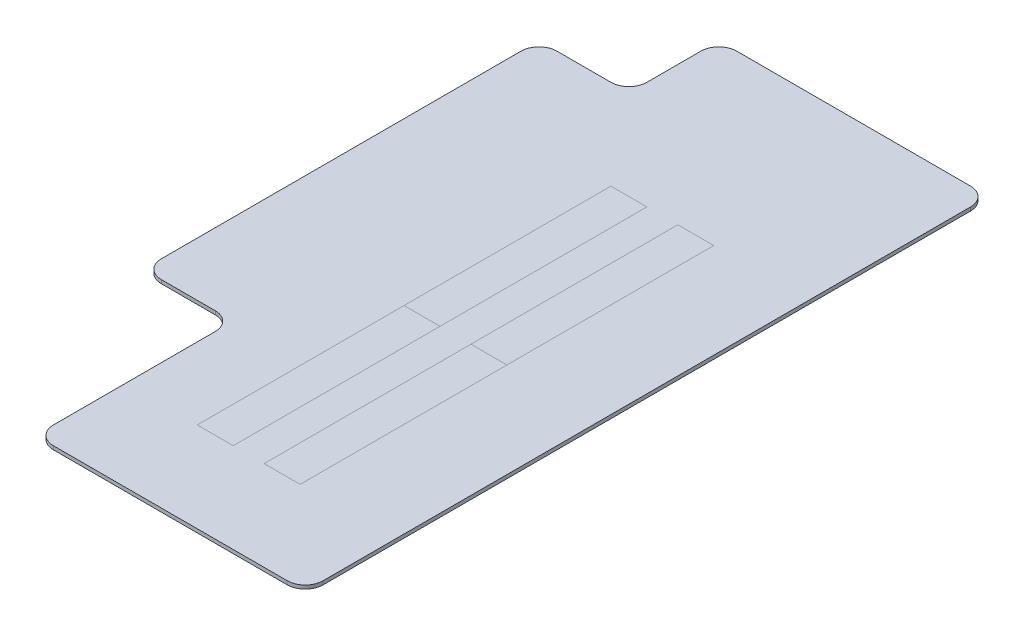
ISO-10303-21;
HEADER;
FILE_DESCRIPTION(('STEP AP214'),'2;1');
FILE_NAME('part.step','',(''),(''),'','','');
FILE_SCHEMA(('AUTOMOTIVE_DESIGN { 1 0 10303 214 1 1 1 1 }'));
ENDSEC;
DATA;
#1=APPLICATION_CONTEXT('core data for automotive mechanical design processes');
#2=APPLICATION_PROTOCOL_DEFINITION('international standard','automotive_design',2000,#1);
#3=PRODUCT_CONTEXT('',#1,'mechanical');
#4=PRODUCT('Part','Part','',(#3));
#5=PRODUCT_RELATED_PRODUCT_CATEGORY('part','',(#4));
#6=PRODUCT_DEFINITION_FORMATION('','',#4);
#7=PRODUCT_DEFINITION_CONTEXT('part definition',#1,'design');
#8=PRODUCT_DEFINITION('design','',#6,#7);
#9=PRODUCT_DEFINITION_SHAPE('','',#8);
#10=(LENGTH_UNIT() NAMED_UNIT(*) SI_UNIT(.MILLI.,.METRE.));
#11=(NAMED_UNIT(*) PLANE_ANGLE_UNIT() SI_UNIT($,.RADIAN.));
#12=(NAMED_UNIT(*) SI_UNIT($,.STERADIAN.) SOLID_ANGLE_UNIT());
#13=UNCERTAINTY_MEASURE_WITH_UNIT(LENGTH_MEASURE(1.E-05),#10,'distance_accuracy_value','');
#14=(GEOMETRIC_REPRESENTATION_CONTEXT(3) GLOBAL_UNCERTAINTY_ASSIGNED_CONTEXT((#13)) GLOBAL_UNIT_ASSIGNED_CONTEXT((#10,
#11,#12)) REPRESENTATION_CONTEXT('',''));
#15=CARTESIAN_POINT('',(0.,0.,0.));
#16=DIRECTION('',(0.,0.,1.));
#17=DIRECTION('',(1.,0.,0.));
#18=AXIS2_PLACEMENT_3D('',#15,#16,#17);
#19=CARTESIAN_POINT('',(-50.,0.,-50.));
#20=DIRECTION('',(0.,1.,0.));
#21=DIRECTION('',(0.,0.,1.));
#22=AXIS2_PLACEMENT_3D('',#19,#20,#21);
#23=PLANE('',#22);
#24=DIRECTION('',(0.,0.,-1.));
#25=VECTOR('',#24,1.);
#26=CARTESIAN_POINT('',(-960.,0.,-50.0000000000001));
#27=LINE('',#26,#25);
#28=CARTESIAN_POINT('',(-960.,0.,-551.010205144337));
#29=VERTEX_POINT('',#28);
#30=CARTESIAN_POINT('',(-960.,0.,-1648.98979485566));
#31=VERTEX_POINT('',#30);
#32=EDGE_CURVE('E11',#29,#31,#27,.T.);
#33=ORIENTED_EDGE('',*,*,#32,.F.);
#34=CARTESIAN_POINT('',(-950.,0.,-600.));
#35=DIRECTION('',(0.,1.,0.));
#36=DIRECTION('',(0.,0.,1.));
#37=AXIS2_PLACEMENT_3D('',#34,#35,#36);
#38=CIRCLE('',#37,50.);
#39=CARTESIAN_POINT('',(-1000.,0.,-600.));
#40=VERTEX_POINT('',#39);
#41=EDGE_CURVE('E338',#40,#29,#38,.T.);
#42=ORIENTED_EDGE('',*,*,#41,.F.);
#43=DIRECTION('',(0.,0.,1.));
#44=VECTOR('',#43,1.);
#45=CARTESIAN_POINT('',(-1000.,0.,-1600.));
#46=LINE('',#45,#44);
#47=CARTESIAN_POINT('',(-1000.,0.,-1600.));
#48=VERTEX_POINT('',#47);
#49=EDGE_CURVE('E426',#48,#40,#46,.T.);
#50=ORIENTED_EDGE('',*,*,#49,.F.);
#51=CARTESIAN_POINT('',(-950.,0.,-1600.));
#52=DIRECTION('',(0.,1.,0.));
#53=DIRECTION('',(0.,0.,-1.));
#54=AXIS2_PLACEMENT_3D('',#51,#52,#53);
#55=CIRCLE('',#54,50.);
#56=EDGE_CURVE('E423',#31,#48,#55,.T.);
#57=ORIENTED_EDGE('',*,*,#56,.F.);
#58=EDGE_LOOP('',(#33,#42,#50,#57));
#59=FACE_BOUND('',#58,.T.);
#60=ADVANCED_FACE('F47',(#59),#23,.F.);
#61=DIRECTION('',(0.,0.,1.));
#62=VECTOR('',#61,1.);
#63=CARTESIAN_POINT('',(-880.,0.,-50.));
#64=LINE('',#63,#62);
#65=CARTESIAN_POINT('',(-880.,0.,-1650.));
#66=VERTEX_POINT('',#65);
#67=CARTESIAN_POINT('',(-880.,0.,-550.));
#68=VERTEX_POINT('',#67);
#69=EDGE_CURVE('E51',#66,#68,#64,.T.);
#70=ORIENTED_EDGE('',*,*,#69,.F.);
#71=DIRECTION('',(-1.,0.,0.));
#72=VECTOR('',#71,1.);
#73=CARTESIAN_POINT('',(-800.,0.,-1650.));
#74=LINE('',#73,#72);
#75=CARTESIAN_POINT('',(-800.,0.,-1650.));
#76=VERTEX_POINT('',#75);
#77=EDGE_CURVE('E421',#76,#66,#74,.T.);
#78=ORIENTED_EDGE('',*,*,#77,.F.);
#79=CARTESIAN_POINT('',(-800.,0.,-1700.));
#80=DIRECTION('',(0.,-1.,0.));
#81=DIRECTION('',(0.,0.,-1.));
#82=AXIS2_PLACEMENT_3D('',#79,#80,#81);
#83=CIRCLE('',#82,50.);
#84=CARTESIAN_POINT('',(-750.,0.,-1700.));
#85=VERTEX_POINT('',#84);
#86=EDGE_CURVE('E419',#85,#76,#83,.T.);
#87=ORIENTED_EDGE('',*,*,#86,.F.);
#88=DIRECTION('',(0.,0.,1.));
#89=VECTOR('',#88,1.);
#90=CARTESIAN_POINT('',(-750.,0.,-1850.));
#91=LINE('',#90,#89);
#92=CARTESIAN_POINT('',(-750.,0.,-1775.27767497326));
#93=VERTEX_POINT('',#92);
#94=EDGE_CURVE('E415',#93,#85,#91,.T.);
#95=ORIENTED_EDGE('',*,*,#94,.F.);
#96=DIRECTION('',(-0.866025403784438,0.,-0.500000000000001));
#97=VECTOR('',#96,1.);
#98=CARTESIAN_POINT('',(522.067147554497,0.,-1040.84936490539));
#99=LINE('',#98,#97);
#100=CARTESIAN_POINT('',(0.,0.,-1342.26497308104));
#101=VERTEX_POINT('',#100);
#102=EDGE_CURVE('E310',#101,#93,#99,.T.);
#103=ORIENTED_EDGE('',*,*,#102,.F.);
#104=DIRECTION('',(0.,0.,-1.));
#105=VECTOR('',#104,1.);
#106=CARTESIAN_POINT('',(0.,0.,-50.0000000000004));
#107=LINE('',#106,#105);
#108=CARTESIAN_POINT('',(0.,0.,-867.735026918963));
#109=VERTEX_POINT('',#108);
#110=EDGE_CURVE('E466',#109,#101,#107,.T.);
#111=ORIENTED_EDGE('',*,*,#110,.F.);
#112=DIRECTION('',(0.866025403784436,0.,-0.500000000000004));
#113=VECTOR('',#112,1.);
#114=CARTESIAN_POINT('',(-391.589653438088,0.,-641.650635094608));
#115=LINE('',#114,#113);
#116=CARTESIAN_POINT('',(-750.,0.,-434.722325026739));
#117=VERTEX_POINT('',#116);
#118=EDGE_CURVE('E304',#117,#109,#115,.T.);
#119=ORIENTED_EDGE('',*,*,#118,.F.);
#120=DIRECTION('',(0.,0.,1.));
#121=VECTOR('',#120,1.);
#122=CARTESIAN_POINT('',(-750.,0.,-500.));
#123=LINE('',#122,#121);
#124=CARTESIAN_POINT('',(-750.,0.,-500.));
#125=VERTEX_POINT('',#124);
#126=EDGE_CURVE('E350',#125,#117,#123,.T.);
#127=ORIENTED_EDGE('',*,*,#126,.F.);
#128=CARTESIAN_POINT('',(-800.,0.,-500.));
#129=DIRECTION('',(0.,-1.,0.));
#130=DIRECTION('',(0.,0.,-1.));
#131=AXIS2_PLACEMENT_3D('',#128,#129,#130);
#132=CIRCLE('',#131,50.);
#133=CARTESIAN_POINT('',(-800.,0.,-550.));
#134=VERTEX_POINT('',#133);
#135=EDGE_CURVE('E334',#134,#125,#132,.T.);
#136=ORIENTED_EDGE('',*,*,#135,.F.);
#137=DIRECTION('',(1.,0.,0.));
#138=VECTOR('',#137,1.);
#139=CARTESIAN_POINT('',(-950.,0.,-550.));
#140=LINE('',#139,#138);
#141=EDGE_CURVE('E331',#68,#134,#140,.T.);
#142=ORIENTED_EDGE('',*,*,#141,.F.);
#143=EDGE_LOOP('',(#70,#78,#87,#95,#103,#111,#119,#127,#136,#142));
#144=FACE_BOUND('',#143,.T.);
#145=ADVANCED_FACE('F332',(#144),#23,.F.);
#146=DIRECTION('',(0.866025403784438,0.,0.500000000000001));
#147=VECTOR('',#146,1.);
#148=CARTESIAN_POINT('',(562.067147554497,0.,-1110.13139720814));
#149=LINE('',#148,#147);
#150=CARTESIAN_POINT('',(-747.332369094292,0.,-1866.11356062209));
#151=VERTEX_POINT('',#150);
#152=CARTESIAN_POINT('',(0.,0.,-1434.64101615138));
#153=VERTEX_POINT('',#152);
#154=EDGE_CURVE('E313',#151,#153,#149,.T.);
#155=ORIENTED_EDGE('',*,*,#154,.F.);
#156=CARTESIAN_POINT('',(-700.,0.,-1850.));
#157=DIRECTION('',(0.,1.,0.));
#158=DIRECTION('',(0.,0.,1.));
#159=AXIS2_PLACEMENT_3D('',#156,#157,#158);
#160=CIRCLE('',#159,50.);
#161=CARTESIAN_POINT('',(-700.,0.,-1900.));
#162=VERTEX_POINT('',#161);
#163=EDGE_CURVE('E407',#162,#151,#160,.T.);
#164=ORIENTED_EDGE('',*,*,#163,.F.);
#165=DIRECTION('',(-1.,0.,0.));
#166=VECTOR('',#165,1.);
#167=CARTESIAN_POINT('',(-50.0000000000004,0.,-1900.));
#168=LINE('',#167,#166);
#169=CARTESIAN_POINT('',(-50.0000000000004,0.,-1900.));
#170=VERTEX_POINT('',#169);
#171=EDGE_CURVE('E398',#170,#162,#168,.T.);
#172=ORIENTED_EDGE('',*,*,#171,.F.);
#173=CARTESIAN_POINT('',(-50.,0.,-1850.));
#174=DIRECTION('',(0.,1.,0.));
#175=DIRECTION('',(0.,0.,1.));
#176=AXIS2_PLACEMENT_3D('',#173,#174,#175);
#177=CIRCLE('',#176,50.);
#178=CARTESIAN_POINT('',(0.,0.,-1850.));
#179=VERTEX_POINT('',#178);
#180=EDGE_CURVE('E405',#179,#170,#177,.T.);
#181=ORIENTED_EDGE('',*,*,#180,.F.);
#182=EDGE_CURVE('E472',#153,#179,#107,.T.);
#183=ORIENTED_EDGE('',*,*,#182,.F.);
#184=EDGE_LOOP('',(#155,#164,#172,#181,#183));
#185=FACE_BOUND('',#184,.T.);
#186=ADVANCED_FACE('F404',(#185),#23,.F.);
#187=CARTESIAN_POINT('',(-950.,0.,-550.));
#188=VERTEX_POINT('',#187);
#189=EDGE_CURVE('E427',#29,#188,#38,.T.);
#190=ORIENTED_EDGE('',*,*,#189,.F.);
#191=ORIENTED_EDGE('',*,*,#32,.T.);
#192=CARTESIAN_POINT('',(-950.,0.,-1650.));
#193=VERTEX_POINT('',#192);
#194=EDGE_CURVE('E424',#193,#31,#55,.T.);
#195=ORIENTED_EDGE('',*,*,#194,.F.);
#196=EDGE_CURVE('E328',#66,#193,#74,.T.);
#197=ORIENTED_EDGE('',*,*,#196,.F.);
#198=ORIENTED_EDGE('',*,*,#69,.T.);
#199=EDGE_CURVE('E327',#188,#68,#140,.T.);
#200=ORIENTED_EDGE('',*,*,#199,.F.);
#201=EDGE_LOOP('',(#190,#191,#195,#197,#198,#200));
#202=FACE_BOUND('',#201,.T.);
#203=ADVANCED_FACE('F325',(#202),#23,.F.);
#204=DIRECTION('',(-0.866025403784436,0.,0.500000000000004));
#205=VECTOR('',#204,1.);
#206=CARTESIAN_POINT('',(-351.589653438089,0.,-572.368602791853));
#207=LINE('',#206,#205);
#208=CARTESIAN_POINT('',(0.,0.,-775.358983848623));
#209=VERTEX_POINT('',#208);
#210=CARTESIAN_POINT('',(-750.,0.,-342.346281956399));
#211=VERTEX_POINT('',#210);
#212=EDGE_CURVE('E307',#209,#211,#207,.T.);
#213=ORIENTED_EDGE('',*,*,#212,.F.);
#214=CARTESIAN_POINT('',(0.,0.,-50.0000000000004));
#215=VERTEX_POINT('',#214);
#216=EDGE_CURVE('E411',#215,#209,#107,.T.);
#217=ORIENTED_EDGE('',*,*,#216,.F.);
#218=CARTESIAN_POINT('',(-50.,0.,-50.));
#219=DIRECTION('',(0.,1.,0.));
#220=DIRECTION('',(0.,0.,1.));
#221=AXIS2_PLACEMENT_3D('',#218,#219,#220);
#222=CIRCLE('',#221,50.);
#223=CARTESIAN_POINT('',(-50.0000000000004,0.,0.));
#224=VERTEX_POINT('',#223);
#225=EDGE_CURVE('E257',#224,#215,#222,.T.);
#226=ORIENTED_EDGE('',*,*,#225,.F.);
#227=DIRECTION('',(1.,0.,0.));
#228=VECTOR('',#227,1.);
#229=CARTESIAN_POINT('',(-700.,0.,0.));
#230=LINE('',#229,#228);
#231=CARTESIAN_POINT('',(-700.,0.,0.));
#232=VERTEX_POINT('',#231);
#233=EDGE_CURVE('E254',#232,#224,#230,.T.);
#234=ORIENTED_EDGE('',*,*,#233,.F.);
#235=CARTESIAN_POINT('',(-700.,0.,-50.));
#236=DIRECTION('',(0.,1.,0.));
#237=DIRECTION('',(0.,0.,1.));
#238=AXIS2_PLACEMENT_3D('',#235,#236,#237);
#239=CIRCLE('',#238,50.);
#240=CARTESIAN_POINT('',(-750.,0.,-50.0000000000004));
#241=VERTEX_POINT('',#240);
#242=EDGE_CURVE('E353',#241,#232,#239,.T.);
#243=ORIENTED_EDGE('',*,*,#242,.F.);
#244=EDGE_CURVE('E345',#211,#241,#123,.T.);
#245=ORIENTED_EDGE('',*,*,#244,.F.);
#246=EDGE_LOOP('',(#213,#217,#226,#234,#243,#245));
#247=FACE_BOUND('',#246,.T.);
#248=ADVANCED_FACE('F524',(#247),#23,.F.);
#249=CARTESIAN_POINT('',(-750.,0.,-1850.));
#250=VERTEX_POINT('',#249);
#251=EDGE_CURVE('E408',#151,#250,#160,.T.);
#252=ORIENTED_EDGE('',*,*,#251,.F.);
#253=ORIENTED_EDGE('',*,*,#154,.T.);
#254=EDGE_CURVE('E463',#101,#153,#107,.T.);
#255=ORIENTED_EDGE('',*,*,#254,.F.);
#256=ORIENTED_EDGE('',*,*,#102,.T.);
#257=EDGE_CURVE('E416',#250,#93,#91,.T.);
#258=ORIENTED_EDGE('',*,*,#257,.F.);
#259=EDGE_LOOP('',(#252,#253,#255,#256,#258));
#260=FACE_BOUND('',#259,.T.);
#261=ADVANCED_FACE('F461',(#260),#23,.F.);
#262=CARTESIAN_POINT('',(-50.,10.,-50.));
#263=DIRECTION('',(0.,1.,0.));
#264=DIRECTION('',(0.,0.,1.));
#265=AXIS2_PLACEMENT_3D('',#262,#263,#264);
#266=PLANE('',#265);
#267=DIRECTION('',(0.,0.,1.));
#268=VECTOR('',#267,1.);
#269=CARTESIAN_POINT('',(-264.,10.,-49.9999999999999));
#270=LINE('',#269,#268);
#271=CARTESIAN_POINT('',(-264.,10.,-825.));
#272=VERTEX_POINT('',#271);
#273=CARTESIAN_POINT('',(-264.,10.,-250.));
#274=VERTEX_POINT('',#273);
#275=EDGE_CURVE('E290',#272,#274,#270,.T.);
#276=ORIENTED_EDGE('',*,*,#275,.F.);
#277=DIRECTION('',(-1.,0.,0.));
#278=VECTOR('',#277,1.);
#279=CARTESIAN_POINT('',(-49.9999999999991,10.,-825.));
#280=LINE('',#279,#278);
#281=CARTESIAN_POINT('',(-364.,10.,-825.));
#282=VERTEX_POINT('',#281);
#283=EDGE_CURVE('E301',#272,#282,#280,.T.);
#284=ORIENTED_EDGE('',*,*,#283,.T.);
#285=DIRECTION('',(0.,0.,-1.));
#286=VECTOR('',#285,1.);
#287=CARTESIAN_POINT('',(-364.,10.,-50.));
#288=LINE('',#287,#286);
#289=CARTESIAN_POINT('',(-364.,10.,-250.));
#290=VERTEX_POINT('',#289);
#291=EDGE_CURVE('E282',#290,#282,#288,.T.);
#292=ORIENTED_EDGE('',*,*,#291,.F.);
#293=DIRECTION('',(-1.,0.,0.));
#294=VECTOR('',#293,1.);
#295=CARTESIAN_POINT('',(-50.,10.,-250.));
#296=LINE('',#295,#294);
#297=EDGE_CURVE('E295',#274,#290,#296,.T.);
#298=ORIENTED_EDGE('',*,*,#297,.F.);
#299=EDGE_LOOP('',(#276,#284,#292,#298));
#300=FACE_BOUND('',#299,.T.);
#301=ADVANCED_FACE('F521',(#300),#266,.T.);
#302=DIRECTION('',(0.,0.,1.));
#303=VECTOR('',#302,1.);
#304=CARTESIAN_POINT('',(-450.,10.,-49.9999999999999));
#305=LINE('',#304,#303);
#306=CARTESIAN_POINT('',(-450.,10.,-825.));
#307=VERTEX_POINT('',#306);
#308=CARTESIAN_POINT('',(-450.,10.,-250.));
#309=VERTEX_POINT('',#308);
#310=EDGE_CURVE('E258',#307,#309,#305,.T.);
#311=ORIENTED_EDGE('',*,*,#310,.F.);
#312=DIRECTION('',(-1.,0.,0.));
#313=VECTOR('',#312,1.);
#314=CARTESIAN_POINT('',(-50.,10.,-825.));
#315=LINE('',#314,#313);
#316=CARTESIAN_POINT('',(-550.,10.,-825.));
#317=VERTEX_POINT('',#316);
#318=EDGE_CURVE('E298',#307,#317,#315,.T.);
#319=ORIENTED_EDGE('',*,*,#318,.T.);
#320=DIRECTION('',(0.,0.,-1.));
#321=VECTOR('',#320,1.);
#322=CARTESIAN_POINT('',(-550.,10.,-50.));
#323=LINE('',#322,#321);
#324=CARTESIAN_POINT('',(-550.,10.,-250.));
#325=VERTEX_POINT('',#324);
#326=EDGE_CURVE('E274',#325,#317,#323,.T.);
#327=ORIENTED_EDGE('',*,*,#326,.F.);
#328=DIRECTION('',(-1.,0.,0.));
#329=VECTOR('',#328,1.);
#330=CARTESIAN_POINT('',(-50.,10.,-250.));
#331=LINE('',#330,#329);
#332=EDGE_CURVE('E269',#309,#325,#331,.T.);
#333=ORIENTED_EDGE('',*,*,#332,.F.);
#334=EDGE_LOOP('',(#311,#319,#327,#333));
#335=FACE_BOUND('',#334,.T.);
#336=ADVANCED_FACE('F529',(#335),#266,.T.);
#337=CARTESIAN_POINT('',(-50.,10.,-50.));
#338=DIRECTION('',(0.,1.,0.));
#339=DIRECTION('',(0.,0.,1.));
#340=AXIS2_PLACEMENT_3D('',#337,#338,#339);
#341=CIRCLE('',#340,50.);
#342=CARTESIAN_POINT('',(-50.0000000000004,10.,0.));
#343=VERTEX_POINT('',#342);
#344=CARTESIAN_POINT('',(0.,10.,-50.0000000000004));
#345=VERTEX_POINT('',#344);
#346=EDGE_CURVE('E244',#343,#345,#341,.T.);
#347=ORIENTED_EDGE('',*,*,#346,.T.);
#348=DIRECTION('',(0.,0.,-1.));
#349=VECTOR('',#348,1.);
#350=CARTESIAN_POINT('',(0.,10.,-50.0000000000004));
#351=LINE('',#350,#349);
#352=CARTESIAN_POINT('',(0.,10.,-1850.));
#353=VERTEX_POINT('',#352);
#354=EDGE_CURVE('E232',#345,#353,#351,.T.);
#355=ORIENTED_EDGE('',*,*,#354,.T.);
#356=CARTESIAN_POINT('',(-50.,10.,-1850.));
#357=DIRECTION('',(0.,1.,0.));
#358=DIRECTION('',(0.,0.,1.));
#359=AXIS2_PLACEMENT_3D('',#356,#357,#358);
#360=CIRCLE('',#359,50.);
#361=CARTESIAN_POINT('',(-50.0000000000004,10.,-1900.));
#362=VERTEX_POINT('',#361);
#363=EDGE_CURVE('E243',#353,#362,#360,.T.);
#364=ORIENTED_EDGE('',*,*,#363,.T.);
#365=DIRECTION('',(-1.,0.,0.));
#366=VECTOR('',#365,1.);
#367=CARTESIAN_POINT('',(-50.0000000000004,10.,-1900.));
#368=LINE('',#367,#366);
#369=CARTESIAN_POINT('',(-700.,10.,-1900.));
#370=VERTEX_POINT('',#369);
#371=EDGE_CURVE('E399',#362,#370,#368,.T.);
#372=ORIENTED_EDGE('',*,*,#371,.T.);
#373=CARTESIAN_POINT('',(-700.,10.,-1850.));
#374=DIRECTION('',(0.,1.,0.));
#375=DIRECTION('',(0.,0.,1.));
#376=AXIS2_PLACEMENT_3D('',#373,#374,#375);
#377=CIRCLE('',#376,50.);
#378=CARTESIAN_POINT('',(-750.,10.,-1850.));
#379=VERTEX_POINT('',#378);
#380=EDGE_CURVE('E492',#370,#379,#377,.T.);
#381=ORIENTED_EDGE('',*,*,#380,.T.);
#382=DIRECTION('',(0.,0.,1.));
#383=VECTOR('',#382,1.);
#384=CARTESIAN_POINT('',(-750.,10.,-1850.));
#385=LINE('',#384,#383);
#386=CARTESIAN_POINT('',(-750.,10.,-1700.));
#387=VERTEX_POINT('',#386);
#388=EDGE_CURVE('E458',#379,#387,#385,.T.);
#389=ORIENTED_EDGE('',*,*,#388,.T.);
#390=CARTESIAN_POINT('',(-800.,10.,-1700.));
#391=DIRECTION('',(0.,-1.,0.));
#392=DIRECTION('',(0.,0.,-1.));
#393=AXIS2_PLACEMENT_3D('',#390,#391,#392);
#394=CIRCLE('',#393,50.);
#395=CARTESIAN_POINT('',(-800.,10.,-1650.));
#396=VERTEX_POINT('',#395);
#397=EDGE_CURVE('E454',#387,#396,#394,.T.);
#398=ORIENTED_EDGE('',*,*,#397,.T.);
#399=DIRECTION('',(-1.,0.,0.));
#400=VECTOR('',#399,1.);
#401=CARTESIAN_POINT('',(-800.,10.,-1650.));
#402=LINE('',#401,#400);
#403=CARTESIAN_POINT('',(-950.,10.,-1650.));
#404=VERTEX_POINT('',#403);
#405=EDGE_CURVE('E446',#396,#404,#402,.T.);
#406=ORIENTED_EDGE('',*,*,#405,.T.);
#407=CARTESIAN_POINT('',(-950.,10.,-1600.));
#408=DIRECTION('',(0.,1.,0.));
#409=DIRECTION('',(0.,0.,-1.));
#410=AXIS2_PLACEMENT_3D('',#407,#408,#409);
#411=CIRCLE('',#410,50.);
#412=CARTESIAN_POINT('',(-1000.,10.,-1600.));
#413=VERTEX_POINT('',#412);
#414=EDGE_CURVE('E442',#404,#413,#411,.T.);
#415=ORIENTED_EDGE('',*,*,#414,.T.);
#416=DIRECTION('',(0.,0.,1.));
#417=VECTOR('',#416,1.);
#418=CARTESIAN_POINT('',(-1000.,10.,-1600.));
#419=LINE('',#418,#417);
#420=CARTESIAN_POINT('',(-1000.,10.,-600.));
#421=VERTEX_POINT('',#420);
#422=EDGE_CURVE('E486',#413,#421,#419,.T.);
#423=ORIENTED_EDGE('',*,*,#422,.T.);
#424=CARTESIAN_POINT('',(-950.,10.,-600.));
#425=DIRECTION('',(0.,1.,0.));
#426=DIRECTION('',(0.,0.,1.));
#427=AXIS2_PLACEMENT_3D('',#424,#425,#426);
#428=CIRCLE('',#427,50.);
#429=CARTESIAN_POINT('',(-950.,10.,-550.));
#430=VERTEX_POINT('',#429);
#431=EDGE_CURVE('E484',#421,#430,#428,.T.);
#432=ORIENTED_EDGE('',*,*,#431,.T.);
#433=DIRECTION('',(1.,0.,0.));
#434=VECTOR('',#433,1.);
#435=CARTESIAN_POINT('',(-950.,10.,-550.));
#436=LINE('',#435,#434);
#437=CARTESIAN_POINT('',(-800.,10.,-550.));
#438=VERTEX_POINT('',#437);
#439=EDGE_CURVE('E482',#430,#438,#436,.T.);
#440=ORIENTED_EDGE('',*,*,#439,.T.);
#441=CARTESIAN_POINT('',(-800.,10.,-500.));
#442=DIRECTION('',(0.,-1.,0.));
#443=DIRECTION('',(0.,0.,-1.));
#444=AXIS2_PLACEMENT_3D('',#441,#442,#443);
#445=CIRCLE('',#444,50.);
#446=CARTESIAN_POINT('',(-750.,10.,-500.));
#447=VERTEX_POINT('',#446);
#448=EDGE_CURVE('E480',#438,#447,#445,.T.);
#449=ORIENTED_EDGE('',*,*,#448,.T.);
#450=DIRECTION('',(0.,0.,1.));
#451=VECTOR('',#450,1.);
#452=CARTESIAN_POINT('',(-750.,10.,-500.));
#453=LINE('',#452,#451);
#454=CARTESIAN_POINT('',(-750.,10.,-50.0000000000004));
#455=VERTEX_POINT('',#454);
#456=EDGE_CURVE('E478',#447,#455,#453,.T.);
#457=ORIENTED_EDGE('',*,*,#456,.T.);
#458=CARTESIAN_POINT('',(-700.,10.,-50.));
#459=DIRECTION('',(0.,1.,0.));
#460=DIRECTION('',(0.,0.,1.));
#461=AXIS2_PLACEMENT_3D('',#458,#459,#460);
#462=CIRCLE('',#461,50.);
#463=CARTESIAN_POINT('',(-700.,10.,0.));
#464=VERTEX_POINT('',#463);
#465=EDGE_CURVE('E476',#455,#464,#462,.T.);
#466=ORIENTED_EDGE('',*,*,#465,.T.);
#467=DIRECTION('',(1.,0.,0.));
#468=VECTOR('',#467,1.);
#469=CARTESIAN_POINT('',(-700.,10.,0.));
#470=LINE('',#469,#468);
#471=EDGE_CURVE('E250',#464,#343,#470,.T.);
#472=ORIENTED_EDGE('',*,*,#471,.T.);
#473=EDGE_LOOP('',(#347,#355,#364,#372,#381,#389,#398,#406,#415,#423,#432,#440,#449,#457,#466,#472));
#474=FACE_BOUND('',#473,.T.);
#475=ORIENTED_EDGE('',*,*,#326,.T.);
#476=CARTESIAN_POINT('',(-550.,10.,-1400.));
#477=VERTEX_POINT('',#476);
#478=EDGE_CURVE('E273',#317,#477,#323,.T.);
#479=ORIENTED_EDGE('',*,*,#478,.T.);
#480=DIRECTION('',(1.,0.,0.));
#481=VECTOR('',#480,1.);
#482=CARTESIAN_POINT('',(-50.,10.,-1400.));
#483=LINE('',#482,#481);
#484=CARTESIAN_POINT('',(-450.,10.,-1400.));
#485=VERTEX_POINT('',#484);
#486=EDGE_CURVE('E278',#477,#485,#483,.T.);
#487=ORIENTED_EDGE('',*,*,#486,.T.);
#488=EDGE_CURVE('E261',#485,#307,#305,.T.);
#489=ORIENTED_EDGE('',*,*,#488,.T.);
#490=ORIENTED_EDGE('',*,*,#310,.T.);
#491=ORIENTED_EDGE('',*,*,#332,.T.);
#492=EDGE_LOOP('',(#475,#479,#487,#489,#490,#491));
#493=FACE_BOUND('',#492,.T.);
#494=CARTESIAN_POINT('',(-264.000000000001,10.,-1400.));
#495=VERTEX_POINT('',#494);
#496=EDGE_CURVE('E291',#495,#272,#270,.T.);
#497=ORIENTED_EDGE('',*,*,#496,.T.);
#498=ORIENTED_EDGE('',*,*,#275,.T.);
#499=ORIENTED_EDGE('',*,*,#297,.T.);
#500=ORIENTED_EDGE('',*,*,#291,.T.);
#501=CARTESIAN_POINT('',(-364.,10.,-1400.));
#502=VERTEX_POINT('',#501);
#503=EDGE_CURVE('E281',#282,#502,#288,.T.);
#504=ORIENTED_EDGE('',*,*,#503,.T.);
#505=DIRECTION('',(1.,0.,0.));
#506=VECTOR('',#505,1.);
#507=CARTESIAN_POINT('',(-50.,10.,-1400.));
#508=LINE('',#507,#506);
#509=EDGE_CURVE('E286',#502,#495,#508,.T.);
#510=ORIENTED_EDGE('',*,*,#509,.T.);
#511=EDGE_LOOP('',(#497,#498,#499,#500,#504,#510));
#512=FACE_BOUND('',#511,.T.);
#513=ADVANCED_FACE('F247',(#474,#493,#512),#266,.T.);
#514=ORIENTED_EDGE('',*,*,#283,.F.);
#515=ORIENTED_EDGE('',*,*,#496,.F.);
#516=ORIENTED_EDGE('',*,*,#509,.F.);
#517=ORIENTED_EDGE('',*,*,#503,.F.);
#518=EDGE_LOOP('',(#514,#515,#516,#517));
#519=FACE_BOUND('',#518,.T.);
#520=ADVANCED_FACE('F522',(#519),#266,.T.);
#521=CARTESIAN_POINT('',(-50.,10.,-50.));
#522=DIRECTION('',(0.,-1.,0.));
#523=DIRECTION('',(0.,0.,-1.));
#524=AXIS2_PLACEMENT_3D('',#521,#522,#523);
#525=CYLINDRICAL_SURFACE('',#524,50.);
#526=ORIENTED_EDGE('',*,*,#225,.T.);
#527=DIRECTION('',(0.,-1.,0.));
#528=VECTOR('',#527,1.);
#529=CARTESIAN_POINT('',(0.,10.,-50.0000000000004));
#530=LINE('',#529,#528);
#531=EDGE_CURVE('E237',#345,#215,#530,.T.);
#532=ORIENTED_EDGE('',*,*,#531,.F.);
#533=ORIENTED_EDGE('',*,*,#346,.F.);
#534=DIRECTION('',(0.,-1.,0.));
#535=VECTOR('',#534,1.);
#536=CARTESIAN_POINT('',(-50.0000000000004,10.,0.));
#537=LINE('',#536,#535);
#538=EDGE_CURVE('E357',#343,#224,#537,.T.);
#539=ORIENTED_EDGE('',*,*,#538,.T.);
#540=EDGE_LOOP('',(#526,#532,#533,#539));
#541=FACE_BOUND('',#540,.T.);
#542=ADVANCED_FACE('F49',(#541),#525,.T.);
#543=CARTESIAN_POINT('',(0.,10.,-50.0000000000004));
#544=DIRECTION('',(-1.,0.,0.));
#545=DIRECTION('',(0.,0.,1.));
#546=AXIS2_PLACEMENT_3D('',#543,#544,#545);
#547=PLANE('',#546);
#548=ORIENTED_EDGE('',*,*,#216,.T.);
#549=EDGE_CURVE('E469',#209,#109,#107,.T.);
#550=ORIENTED_EDGE('',*,*,#549,.T.);
#551=ORIENTED_EDGE('',*,*,#110,.T.);
#552=ORIENTED_EDGE('',*,*,#254,.T.);
#553=ORIENTED_EDGE('',*,*,#182,.T.);
#554=DIRECTION('',(0.,-1.,0.));
#555=VECTOR('',#554,1.);
#556=CARTESIAN_POINT('',(0.,10.,-1850.));
#557=LINE('',#556,#555);
#558=EDGE_CURVE('E240',#353,#179,#557,.T.);
#559=ORIENTED_EDGE('',*,*,#558,.F.);
#560=ORIENTED_EDGE('',*,*,#354,.F.);
#561=ORIENTED_EDGE('',*,*,#531,.T.);
#562=EDGE_LOOP('',(#548,#550,#551,#552,#553,#559,#560,#561));
#563=FACE_BOUND('',#562,.T.);
#564=ADVANCED_FACE('F235',(#563),#547,.F.);
#565=CARTESIAN_POINT('',(-50.,10.,-1850.));
#566=DIRECTION('',(0.,-1.,0.));
#567=DIRECTION('',(0.,0.,-1.));
#568=AXIS2_PLACEMENT_3D('',#565,#566,#567);
#569=CYLINDRICAL_SURFACE('',#568,50.);
#570=ORIENTED_EDGE('',*,*,#180,.T.);
#571=DIRECTION('',(0.,-1.,0.));
#572=VECTOR('',#571,1.);
#573=CARTESIAN_POINT('',(-50.0000000000004,10.,-1900.));
#574=LINE('',#573,#572);
#575=EDGE_CURVE('E263',#362,#170,#574,.T.);
#576=ORIENTED_EDGE('',*,*,#575,.F.);
#577=ORIENTED_EDGE('',*,*,#363,.F.);
#578=ORIENTED_EDGE('',*,*,#558,.T.);
#579=EDGE_LOOP('',(#570,#576,#577,#578));
#580=FACE_BOUND('',#579,.T.);
#581=ADVANCED_FACE('F495',(#580),#569,.T.);
#582=CARTESIAN_POINT('',(-50.0000000000004,10.,-1900.));
#583=DIRECTION('',(0.,0.,1.));
#584=DIRECTION('',(1.,0.,0.));
#585=AXIS2_PLACEMENT_3D('',#582,#583,#584);
#586=PLANE('',#585);
#587=ORIENTED_EDGE('',*,*,#171,.T.);
#588=DIRECTION('',(0.,-1.,0.));
#589=VECTOR('',#588,1.);
#590=CARTESIAN_POINT('',(-700.,10.,-1900.));
#591=LINE('',#590,#589);
#592=EDGE_CURVE('E389',#370,#162,#591,.T.);
#593=ORIENTED_EDGE('',*,*,#592,.F.);
#594=ORIENTED_EDGE('',*,*,#371,.F.);
#595=ORIENTED_EDGE('',*,*,#575,.T.);
#596=EDGE_LOOP('',(#587,#593,#594,#595));
#597=FACE_BOUND('',#596,.T.);
#598=ADVANCED_FACE('F396',(#597),#586,.F.);
#599=CARTESIAN_POINT('',(-700.,10.,-1850.));
#600=DIRECTION('',(0.,-1.,0.));
#601=DIRECTION('',(0.,0.,-1.));
#602=AXIS2_PLACEMENT_3D('',#599,#600,#601);
#603=CYLINDRICAL_SURFACE('',#602,50.);
#604=ORIENTED_EDGE('',*,*,#163,.T.);
#605=ORIENTED_EDGE('',*,*,#251,.T.);
#606=DIRECTION('',(0.,-1.,0.));
#607=VECTOR('',#606,1.);
#608=CARTESIAN_POINT('',(-750.,10.,-1850.));
#609=LINE('',#608,#607);
#610=EDGE_CURVE('E386',#379,#250,#609,.T.);
#611=ORIENTED_EDGE('',*,*,#610,.F.);
#612=ORIENTED_EDGE('',*,*,#380,.F.);
#613=ORIENTED_EDGE('',*,*,#592,.T.);
#614=EDGE_LOOP('',(#604,#605,#611,#612,#613));
#615=FACE_BOUND('',#614,.T.);
#616=ADVANCED_FACE('F502',(#615),#603,.T.);
#617=CARTESIAN_POINT('',(-750.,10.,-1850.));
#618=DIRECTION('',(1.,0.,0.));
#619=DIRECTION('',(0.,0.,-1.));
#620=AXIS2_PLACEMENT_3D('',#617,#618,#619);
#621=PLANE('',#620);
#622=ORIENTED_EDGE('',*,*,#257,.T.);
#623=ORIENTED_EDGE('',*,*,#94,.T.);
#624=DIRECTION('',(0.,-1.,0.));
#625=VECTOR('',#624,1.);
#626=CARTESIAN_POINT('',(-750.,10.,-1700.));
#627=LINE('',#626,#625);
#628=EDGE_CURVE('E383',#387,#85,#627,.T.);
#629=ORIENTED_EDGE('',*,*,#628,.F.);
#630=ORIENTED_EDGE('',*,*,#388,.F.);
#631=ORIENTED_EDGE('',*,*,#610,.T.);
#632=EDGE_LOOP('',(#622,#623,#629,#630,#631));
#633=FACE_BOUND('',#632,.T.);
#634=ADVANCED_FACE('F457',(#633),#621,.F.);
#635=CARTESIAN_POINT('',(-800.,10.,-1700.));
#636=DIRECTION('',(0.,-1.,0.));
#637=DIRECTION('',(0.,0.,-1.));
#638=AXIS2_PLACEMENT_3D('',#635,#636,#637);
#639=CYLINDRICAL_SURFACE('',#638,50.);
#640=ORIENTED_EDGE('',*,*,#86,.T.);
#641=DIRECTION('',(0.,-1.,0.));
#642=VECTOR('',#641,1.);
#643=CARTESIAN_POINT('',(-800.,10.,-1650.));
#644=LINE('',#643,#642);
#645=EDGE_CURVE('E380',#396,#76,#644,.T.);
#646=ORIENTED_EDGE('',*,*,#645,.F.);
#647=ORIENTED_EDGE('',*,*,#397,.F.);
#648=ORIENTED_EDGE('',*,*,#628,.T.);
#649=EDGE_LOOP('',(#640,#646,#647,#648));
#650=FACE_BOUND('',#649,.T.);
#651=ADVANCED_FACE('F451',(#650),#639,.F.);
#652=CARTESIAN_POINT('',(-800.,10.,-1650.));
#653=DIRECTION('',(0.,0.,1.));
#654=DIRECTION('',(1.,0.,0.));
#655=AXIS2_PLACEMENT_3D('',#652,#653,#654);
#656=PLANE('',#655);
#657=ORIENTED_EDGE('',*,*,#77,.T.);
#658=ORIENTED_EDGE('',*,*,#196,.T.);
#659=DIRECTION('',(0.,-1.,0.));
#660=VECTOR('',#659,1.);
#661=CARTESIAN_POINT('',(-950.,10.,-1650.));
#662=LINE('',#661,#660);
#663=EDGE_CURVE('E377',#404,#193,#662,.T.);
#664=ORIENTED_EDGE('',*,*,#663,.F.);
#665=ORIENTED_EDGE('',*,*,#405,.F.);
#666=ORIENTED_EDGE('',*,*,#645,.T.);
#667=EDGE_LOOP('',(#657,#658,#664,#665,#666));
#668=FACE_BOUND('',#667,.T.);
#669=ADVANCED_FACE('F445',(#668),#656,.F.);
#670=CARTESIAN_POINT('',(-950.,10.,-1600.));
#671=DIRECTION('',(0.,-1.,0.));
#672=DIRECTION('',(0.,0.,-1.));
#673=AXIS2_PLACEMENT_3D('',#670,#671,#672);
#674=CYLINDRICAL_SURFACE('',#673,50.);
#675=ORIENTED_EDGE('',*,*,#194,.T.);
#676=ORIENTED_EDGE('',*,*,#56,.T.);
#677=DIRECTION('',(0.,-1.,0.));
#678=VECTOR('',#677,1.);
#679=CARTESIAN_POINT('',(-1000.,10.,-1600.));
#680=LINE('',#679,#678);
#681=EDGE_CURVE('E374',#413,#48,#680,.T.);
#682=ORIENTED_EDGE('',*,*,#681,.F.);
#683=ORIENTED_EDGE('',*,*,#414,.F.);
#684=ORIENTED_EDGE('',*,*,#663,.T.);
#685=EDGE_LOOP('',(#675,#676,#682,#683,#684));
#686=FACE_BOUND('',#685,.T.);
#687=ADVANCED_FACE('F439',(#686),#674,.T.);
#688=CARTESIAN_POINT('',(-1000.,10.,-1600.));
#689=DIRECTION('',(1.,0.,0.));
#690=DIRECTION('',(0.,0.,-1.));
#691=AXIS2_PLACEMENT_3D('',#688,#689,#690);
#692=PLANE('',#691);
#693=ORIENTED_EDGE('',*,*,#49,.T.);
#694=DIRECTION('',(0.,-1.,0.));
#695=VECTOR('',#694,1.);
#696=CARTESIAN_POINT('',(-1000.,10.,-600.));
#697=LINE('',#696,#695);
#698=EDGE_CURVE('E371',#421,#40,#697,.T.);
#699=ORIENTED_EDGE('',*,*,#698,.F.);
#700=ORIENTED_EDGE('',*,*,#422,.F.);
#701=ORIENTED_EDGE('',*,*,#681,.T.);
#702=EDGE_LOOP('',(#693,#699,#700,#701));
#703=FACE_BOUND('',#702,.T.);
#704=ADVANCED_FACE('F547',(#703),#692,.F.);
#705=CARTESIAN_POINT('',(-950.,10.,-600.));
#706=DIRECTION('',(0.,-1.,0.));
#707=DIRECTION('',(0.,0.,-1.));
#708=AXIS2_PLACEMENT_3D('',#705,#706,#707);
#709=CYLINDRICAL_SURFACE('',#708,50.);
#710=ORIENTED_EDGE('',*,*,#41,.T.);
#711=ORIENTED_EDGE('',*,*,#189,.T.);
#712=DIRECTION('',(0.,-1.,0.));
#713=VECTOR('',#712,1.);
#714=CARTESIAN_POINT('',(-950.,10.,-550.));
#715=LINE('',#714,#713);
#716=EDGE_CURVE('E344',#430,#188,#715,.T.);
#717=ORIENTED_EDGE('',*,*,#716,.F.);
#718=ORIENTED_EDGE('',*,*,#431,.F.);
#719=ORIENTED_EDGE('',*,*,#698,.T.);
#720=EDGE_LOOP('',(#710,#711,#717,#718,#719));
#721=FACE_BOUND('',#720,.T.);
#722=ADVANCED_FACE('F434',(#721),#709,.T.);
#723=CARTESIAN_POINT('',(-950.,10.,-550.));
#724=DIRECTION('',(0.,0.,-1.));
#725=DIRECTION('',(-1.,0.,0.));
#726=AXIS2_PLACEMENT_3D('',#723,#724,#725);
#727=PLANE('',#726);
#728=ORIENTED_EDGE('',*,*,#199,.T.);
#729=ORIENTED_EDGE('',*,*,#141,.T.);
#730=DIRECTION('',(0.,-1.,0.));
#731=VECTOR('',#730,1.);
#732=CARTESIAN_POINT('',(-800.,10.,-550.));
#733=LINE('',#732,#731);
#734=EDGE_CURVE('E368',#438,#134,#733,.T.);
#735=ORIENTED_EDGE('',*,*,#734,.F.);
#736=ORIENTED_EDGE('',*,*,#439,.F.);
#737=ORIENTED_EDGE('',*,*,#716,.T.);
#738=EDGE_LOOP('',(#728,#729,#735,#736,#737));
#739=FACE_BOUND('',#738,.T.);
#740=ADVANCED_FACE('F341',(#739),#727,.F.);
#741=CARTESIAN_POINT('',(-800.,10.,-500.));
#742=DIRECTION('',(0.,-1.,0.));
#743=DIRECTION('',(0.,0.,-1.));
#744=AXIS2_PLACEMENT_3D('',#741,#742,#743);
#745=CYLINDRICAL_SURFACE('',#744,50.);
#746=ORIENTED_EDGE('',*,*,#135,.T.);
#747=DIRECTION('',(0.,-1.,0.));
#748=VECTOR('',#747,1.);
#749=CARTESIAN_POINT('',(-750.,10.,-500.));
#750=LINE('',#749,#748);
#751=EDGE_CURVE('E365',#447,#125,#750,.T.);
#752=ORIENTED_EDGE('',*,*,#751,.F.);
#753=ORIENTED_EDGE('',*,*,#448,.F.);
#754=ORIENTED_EDGE('',*,*,#734,.T.);
#755=EDGE_LOOP('',(#746,#752,#753,#754));
#756=FACE_BOUND('',#755,.T.);
#757=ADVANCED_FACE('F545',(#756),#745,.F.);
#758=CARTESIAN_POINT('',(-750.,10.,-500.));
#759=DIRECTION('',(1.,0.,0.));
#760=DIRECTION('',(0.,0.,-1.));
#761=AXIS2_PLACEMENT_3D('',#758,#759,#760);
#762=PLANE('',#761);
#763=ORIENTED_EDGE('',*,*,#126,.T.);
#764=EDGE_CURVE('E354',#117,#211,#123,.T.);
#765=ORIENTED_EDGE('',*,*,#764,.T.);
#766=ORIENTED_EDGE('',*,*,#244,.T.);
#767=DIRECTION('',(0.,-1.,0.));
#768=VECTOR('',#767,1.);
#769=CARTESIAN_POINT('',(-750.,10.,-50.0000000000004));
#770=LINE('',#769,#768);
#771=EDGE_CURVE('E362',#455,#241,#770,.T.);
#772=ORIENTED_EDGE('',*,*,#771,.F.);
#773=ORIENTED_EDGE('',*,*,#456,.F.);
#774=ORIENTED_EDGE('',*,*,#751,.T.);
#775=EDGE_LOOP('',(#763,#765,#766,#772,#773,#774));
#776=FACE_BOUND('',#775,.T.);
#777=ADVANCED_FACE('F539',(#776),#762,.F.);
#778=CARTESIAN_POINT('',(-700.,10.,-50.));
#779=DIRECTION('',(0.,-1.,0.));
#780=DIRECTION('',(0.,0.,-1.));
#781=AXIS2_PLACEMENT_3D('',#778,#779,#780);
#782=CYLINDRICAL_SURFACE('',#781,50.);
#783=ORIENTED_EDGE('',*,*,#242,.T.);
#784=DIRECTION('',(0.,-1.,0.));
#785=VECTOR('',#784,1.);
#786=CARTESIAN_POINT('',(-700.,10.,0.));
#787=LINE('',#786,#785);
#788=EDGE_CURVE('E359',#464,#232,#787,.T.);
#789=ORIENTED_EDGE('',*,*,#788,.F.);
#790=ORIENTED_EDGE('',*,*,#465,.F.);
#791=ORIENTED_EDGE('',*,*,#771,.T.);
#792=EDGE_LOOP('',(#783,#789,#790,#791));
#793=FACE_BOUND('',#792,.T.);
#794=ADVANCED_FACE('F606',(#793),#782,.T.);
#795=CARTESIAN_POINT('',(-700.,10.,0.));
#796=DIRECTION('',(0.,0.,-1.));
#797=DIRECTION('',(-1.,0.,0.));
#798=AXIS2_PLACEMENT_3D('',#795,#796,#797);
#799=PLANE('',#798);
#800=ORIENTED_EDGE('',*,*,#233,.T.);
#801=ORIENTED_EDGE('',*,*,#538,.F.);
#802=ORIENTED_EDGE('',*,*,#471,.F.);
#803=ORIENTED_EDGE('',*,*,#788,.T.);
#804=EDGE_LOOP('',(#800,#801,#802,#803));
#805=FACE_BOUND('',#804,.T.);
#806=ADVANCED_FACE('F519',(#805),#799,.F.);
#807=ORIENTED_EDGE('',*,*,#318,.F.);
#808=ORIENTED_EDGE('',*,*,#488,.F.);
#809=ORIENTED_EDGE('',*,*,#486,.F.);
#810=ORIENTED_EDGE('',*,*,#478,.F.);
#811=EDGE_LOOP('',(#807,#808,#809,#810));
#812=FACE_BOUND('',#811,.T.);
#813=ADVANCED_FACE('F515',(#812),#266,.T.);
#814=ORIENTED_EDGE('',*,*,#549,.F.);
#815=ORIENTED_EDGE('',*,*,#212,.T.);
#816=ORIENTED_EDGE('',*,*,#764,.F.);
#817=ORIENTED_EDGE('',*,*,#118,.T.);
#818=EDGE_LOOP('',(#814,#815,#816,#817));
#819=FACE_BOUND('',#818,.T.);
#820=ADVANCED_FACE('F507',(#819),#23,.F.);
#821=CLOSED_SHELL('',(#60,#145,#186,#203,#248,#261,#301,#336,#513,#520,#542,#564,#581,#598,#616,
#634,#651,#669,#687,#704,#722,#740,#757,#777,#794,#806,#813,#820));
#822=MANIFOLD_SOLID_BREP('B2',#821);
#823=ADVANCED_BREP_SHAPE_REPRESENTATION('',(#18,#822),#14);
#824=SHAPE_DEFINITION_REPRESENTATION(#9,#823);
ENDSEC;
END-ISO-10303-21;
